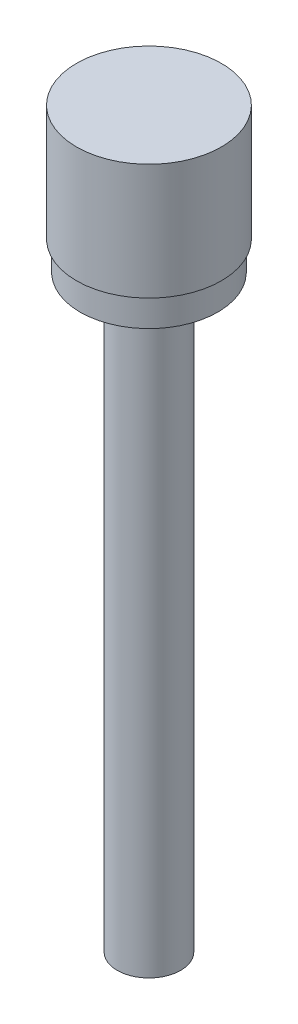
ISO-10303-21;
HEADER;
FILE_DESCRIPTION(('STEP AP214'),'2;1');
FILE_NAME('part.step','',(''),(''),'','','');
FILE_SCHEMA(('AUTOMOTIVE_DESIGN { 1 0 10303 214 1 1 1 1 }'));
ENDSEC;
DATA;
#1=APPLICATION_CONTEXT('core data for automotive mechanical design processes');
#2=APPLICATION_PROTOCOL_DEFINITION('international standard','automotive_design',2000,#1);
#3=PRODUCT_CONTEXT('',#1,'mechanical');
#4=PRODUCT('Part','Part','',(#3));
#5=PRODUCT_RELATED_PRODUCT_CATEGORY('part','',(#4));
#6=PRODUCT_DEFINITION_FORMATION('','',#4);
#7=PRODUCT_DEFINITION_CONTEXT('part definition',#1,'design');
#8=PRODUCT_DEFINITION('design','',#6,#7);
#9=PRODUCT_DEFINITION_SHAPE('','',#8);
#10=(LENGTH_UNIT() NAMED_UNIT(*) SI_UNIT(.MILLI.,.METRE.));
#11=(NAMED_UNIT(*) PLANE_ANGLE_UNIT() SI_UNIT($,.RADIAN.));
#12=(NAMED_UNIT(*) SI_UNIT($,.STERADIAN.) SOLID_ANGLE_UNIT());
#13=UNCERTAINTY_MEASURE_WITH_UNIT(LENGTH_MEASURE(1.E-05),#10,'distance_accuracy_value','');
#14=(GEOMETRIC_REPRESENTATION_CONTEXT(3) GLOBAL_UNCERTAINTY_ASSIGNED_CONTEXT((#13)) GLOBAL_UNIT_ASSIGNED_CONTEXT((#10,
#11,#12)) REPRESENTATION_CONTEXT('',''));
#15=CARTESIAN_POINT('',(0.,0.,0.));
#16=DIRECTION('',(0.,0.,1.));
#17=DIRECTION('',(1.,0.,0.));
#18=AXIS2_PLACEMENT_3D('',#15,#16,#17);
#19=CARTESIAN_POINT('',(3.8,10.,0.));
#20=DIRECTION('',(0.,-1.,0.));
#21=DIRECTION('',(0.,0.,-1.));
#22=AXIS2_PLACEMENT_3D('',#19,#20,#21);
#23=PLANE('',#22);
#24=CARTESIAN_POINT('',(0.,10.,0.));
#25=DIRECTION('',(0.,1.,0.));
#26=DIRECTION('',(0.,0.,1.));
#27=AXIS2_PLACEMENT_3D('',#24,#25,#26);
#28=CIRCLE('',#27,3.8);
#29=CARTESIAN_POINT('',(0.,10.,3.8));
#30=VERTEX_POINT('',#29);
#31=EDGE_CURVE('E11',#30,#30,#28,.T.);
#32=ORIENTED_EDGE('',*,*,#31,.F.);
#33=EDGE_LOOP('',(#32));
#34=FACE_BOUND('',#33,.T.);
#35=CARTESIAN_POINT('',(0.,10.,0.));
#36=DIRECTION('',(0.,1.,0.));
#37=DIRECTION('',(0.,0.,1.));
#38=AXIS2_PLACEMENT_3D('',#35,#36,#37);
#39=CIRCLE('',#38,1.75);
#40=CARTESIAN_POINT('',(0.,10.,1.75));
#41=VERTEX_POINT('',#40);
#42=EDGE_CURVE('E61',#41,#41,#39,.T.);
#43=ORIENTED_EDGE('',*,*,#42,.T.);
#44=EDGE_LOOP('',(#43));
#45=FACE_BOUND('',#44,.T.);
#46=ADVANCED_FACE('F16',(#34,#45),#23,.T.);
#47=CARTESIAN_POINT('',(0.,10.,0.));
#48=DIRECTION('',(0.,1.,0.));
#49=DIRECTION('',(0.,0.,1.));
#50=AXIS2_PLACEMENT_3D('',#47,#48,#49);
#51=CYLINDRICAL_SURFACE('',#50,3.8);
#52=CARTESIAN_POINT('',(0.,11.6,0.));
#53=DIRECTION('',(0.,1.,0.));
#54=DIRECTION('',(0.,0.,1.));
#55=AXIS2_PLACEMENT_3D('',#52,#53,#54);
#56=CIRCLE('',#55,3.8);
#57=CARTESIAN_POINT('',(0.,11.6,3.8));
#58=VERTEX_POINT('',#57);
#59=EDGE_CURVE('E24',#58,#58,#56,.T.);
#60=ORIENTED_EDGE('',*,*,#59,.F.);
#61=EDGE_LOOP('',(#60));
#62=FACE_BOUND('',#61,.T.);
#63=ORIENTED_EDGE('',*,*,#31,.T.);
#64=EDGE_LOOP('',(#63));
#65=FACE_BOUND('',#64,.T.);
#66=ADVANCED_FACE('F80',(#62,#65),#51,.T.);
#67=CARTESIAN_POINT('',(4.,11.6,0.));
#68=DIRECTION('',(0.,-1.,0.));
#69=DIRECTION('',(0.,0.,-1.));
#70=AXIS2_PLACEMENT_3D('',#67,#68,#69);
#71=PLANE('',#70);
#72=CARTESIAN_POINT('',(0.,11.6,0.));
#73=DIRECTION('',(0.,1.,0.));
#74=DIRECTION('',(0.,0.,1.));
#75=AXIS2_PLACEMENT_3D('',#72,#73,#74);
#76=CIRCLE('',#75,4.);
#77=CARTESIAN_POINT('',(0.,11.6,4.));
#78=VERTEX_POINT('',#77);
#79=EDGE_CURVE('E69',#78,#78,#76,.T.);
#80=ORIENTED_EDGE('',*,*,#79,.F.);
#81=EDGE_LOOP('',(#80));
#82=FACE_BOUND('',#81,.T.);
#83=ORIENTED_EDGE('',*,*,#59,.T.);
#84=EDGE_LOOP('',(#83));
#85=FACE_BOUND('',#84,.T.);
#86=ADVANCED_FACE('F78',(#82,#85),#71,.T.);
#87=CARTESIAN_POINT('',(0.,10.,0.));
#88=DIRECTION('',(0.,1.,0.));
#89=DIRECTION('',(0.,0.,1.));
#90=AXIS2_PLACEMENT_3D('',#87,#88,#89);
#91=CYLINDRICAL_SURFACE('',#90,4.);
#92=CARTESIAN_POINT('',(0.,18.,0.));
#93=DIRECTION('',(0.,1.,0.));
#94=DIRECTION('',(0.,0.,1.));
#95=AXIS2_PLACEMENT_3D('',#92,#93,#94);
#96=CIRCLE('',#95,4.);
#97=CARTESIAN_POINT('',(0.,18.,4.));
#98=VERTEX_POINT('',#97);
#99=EDGE_CURVE('E65',#98,#98,#96,.T.);
#100=ORIENTED_EDGE('',*,*,#99,.F.);
#101=EDGE_LOOP('',(#100));
#102=FACE_BOUND('',#101,.T.);
#103=ORIENTED_EDGE('',*,*,#79,.T.);
#104=EDGE_LOOP('',(#103));
#105=FACE_BOUND('',#104,.T.);
#106=ADVANCED_FACE('F76',(#102,#105),#91,.T.);
#107=CARTESIAN_POINT('',(0.,18.,0.));
#108=DIRECTION('',(0.,1.,0.));
#109=DIRECTION('',(1.,0.,0.));
#110=AXIS2_PLACEMENT_3D('',#107,#108,#109);
#111=PLANE('',#110);
#112=ORIENTED_EDGE('',*,*,#99,.T.);
#113=EDGE_LOOP('',(#112));
#114=FACE_BOUND('',#113,.T.);
#115=ADVANCED_FACE('F87',(#114),#111,.T.);
#116=CARTESIAN_POINT('',(1.75,-22.5,0.));
#117=DIRECTION('',(0.,-1.,0.));
#118=DIRECTION('',(0.,0.,-1.));
#119=AXIS2_PLACEMENT_3D('',#116,#117,#118);
#120=PLANE('',#119);
#121=CARTESIAN_POINT('',(0.,-22.5,0.));
#122=DIRECTION('',(0.,1.,0.));
#123=DIRECTION('',(0.,0.,1.));
#124=AXIS2_PLACEMENT_3D('',#121,#122,#123);
#125=CIRCLE('',#124,1.75);
#126=CARTESIAN_POINT('',(0.,-22.5,1.75));
#127=VERTEX_POINT('',#126);
#128=EDGE_CURVE('E57',#127,#127,#125,.T.);
#129=ORIENTED_EDGE('',*,*,#128,.F.);
#130=EDGE_LOOP('',(#129));
#131=FACE_BOUND('',#130,.T.);
#132=ADVANCED_FACE('F101',(#131),#120,.T.);
#133=CARTESIAN_POINT('',(0.,-22.5,0.));
#134=DIRECTION('',(0.,1.,0.));
#135=DIRECTION('',(0.,0.,1.));
#136=AXIS2_PLACEMENT_3D('',#133,#134,#135);
#137=CYLINDRICAL_SURFACE('',#136,1.75);
#138=ORIENTED_EDGE('',*,*,#42,.F.);
#139=EDGE_LOOP('',(#138));
#140=FACE_BOUND('',#139,.T.);
#141=ORIENTED_EDGE('',*,*,#128,.T.);
#142=EDGE_LOOP('',(#141));
#143=FACE_BOUND('',#142,.T.);
#144=ADVANCED_FACE('F58',(#140,#143),#137,.T.);
#145=CLOSED_SHELL('',(#46,#66,#86,#106,#115,#132,#144));
#146=MANIFOLD_SOLID_BREP('B1',#145);
#147=ADVANCED_BREP_SHAPE_REPRESENTATION('',(#18,#146),#14);
#148=SHAPE_DEFINITION_REPRESENTATION(#9,#147);
ENDSEC;
END-ISO-10303-21;
